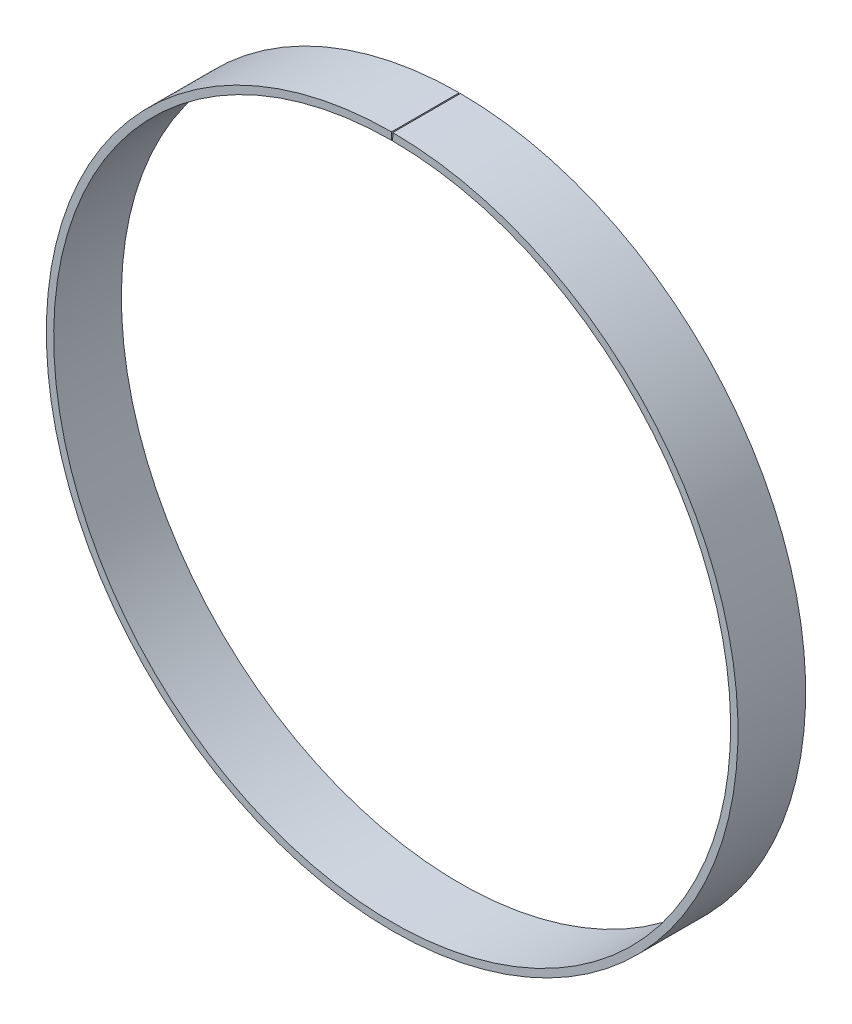
ISO-10303-21;
HEADER;
FILE_DESCRIPTION(('STEP AP214'),'2;1');
FILE_NAME('part.step','',(''),(''),'','','');
FILE_SCHEMA(('AUTOMOTIVE_DESIGN { 1 0 10303 214 1 1 1 1 }'));
ENDSEC;
DATA;
#1=APPLICATION_CONTEXT('core data for automotive mechanical design processes');
#2=APPLICATION_PROTOCOL_DEFINITION('international standard','automotive_design',2000,#1);
#3=PRODUCT_CONTEXT('',#1,'mechanical');
#4=PRODUCT('Part','Part','',(#3));
#5=PRODUCT_RELATED_PRODUCT_CATEGORY('part','',(#4));
#6=PRODUCT_DEFINITION_FORMATION('','',#4);
#7=PRODUCT_DEFINITION_CONTEXT('part definition',#1,'design');
#8=PRODUCT_DEFINITION('design','',#6,#7);
#9=PRODUCT_DEFINITION_SHAPE('','',#8);
#10=(LENGTH_UNIT() NAMED_UNIT(*) SI_UNIT(.MILLI.,.METRE.));
#11=(NAMED_UNIT(*) PLANE_ANGLE_UNIT() SI_UNIT($,.RADIAN.));
#12=(NAMED_UNIT(*) SI_UNIT($,.STERADIAN.) SOLID_ANGLE_UNIT());
#13=UNCERTAINTY_MEASURE_WITH_UNIT(LENGTH_MEASURE(1.E-05),#10,'distance_accuracy_value','');
#14=(GEOMETRIC_REPRESENTATION_CONTEXT(3) GLOBAL_UNCERTAINTY_ASSIGNED_CONTEXT((#13)) GLOBAL_UNIT_ASSIGNED_CONTEXT((#10,
#11,#12)) REPRESENTATION_CONTEXT('',''));
#15=CARTESIAN_POINT('',(0.,0.,0.));
#16=DIRECTION('',(0.,0.,1.));
#17=DIRECTION('',(1.,0.,0.));
#18=AXIS2_PLACEMENT_3D('',#15,#16,#17);
#19=CARTESIAN_POINT('',(0.,0.,23.));
#20=DIRECTION('',(0.,0.,-1.));
#21=DIRECTION('',(-1.,0.,0.));
#22=AXIS2_PLACEMENT_3D('',#19,#20,#21);
#23=CYLINDRICAL_SURFACE('',#22,117.5);
#24=CARTESIAN_POINT('',(0.,0.,0.));
#25=DIRECTION('',(0.,0.,1.));
#26=DIRECTION('',(1.,0.,0.));
#27=AXIS2_PLACEMENT_3D('',#24,#25,#26);
#28=CIRCLE('',#27,117.5);
#29=CARTESIAN_POINT('',(-0.205076082993084,117.499821037311,0.));
#30=VERTEX_POINT('',#29);
#31=CARTESIAN_POINT('',(0.205076082993046,117.499821037311,0.));
#32=VERTEX_POINT('',#31);
#33=EDGE_CURVE('E101',#30,#32,#28,.T.);
#34=ORIENTED_EDGE('',*,*,#33,.T.);
#35=DIRECTION('',(0.,0.,-1.));
#36=VECTOR('',#35,1.);
#37=CARTESIAN_POINT('',(0.205076082993046,117.499821037311,23.));
#38=LINE('',#37,#36);
#39=CARTESIAN_POINT('',(0.205076082993046,117.499821037311,23.));
#40=VERTEX_POINT('',#39);
#41=EDGE_CURVE('E11',#40,#32,#38,.T.);
#42=ORIENTED_EDGE('',*,*,#41,.F.);
#43=CARTESIAN_POINT('',(0.,0.,23.));
#44=DIRECTION('',(0.,0.,1.));
#45=DIRECTION('',(1.,0.,0.));
#46=AXIS2_PLACEMENT_3D('',#43,#44,#45);
#47=CIRCLE('',#46,117.5);
#48=CARTESIAN_POINT('',(-0.205076082993084,117.499821037311,23.));
#49=VERTEX_POINT('',#48);
#50=EDGE_CURVE('E78',#49,#40,#47,.T.);
#51=ORIENTED_EDGE('',*,*,#50,.F.);
#52=DIRECTION('',(0.,0.,-1.));
#53=VECTOR('',#52,1.);
#54=CARTESIAN_POINT('',(-0.205076082993084,117.499821037311,23.));
#55=LINE('',#54,#53);
#56=EDGE_CURVE('E54',#49,#30,#55,.T.);
#57=ORIENTED_EDGE('',*,*,#56,.T.);
#58=EDGE_LOOP('',(#34,#42,#51,#57));
#59=FACE_BOUND('',#58,.T.);
#60=ADVANCED_FACE('F38',(#59),#23,.T.);
#61=CARTESIAN_POINT('',(0.2007127620783,114.999824845028,23.));
#62=DIRECTION('',(-0.999998476913288,0.00174532836589825,0.));
#63=DIRECTION('',(-0.00174532836589825,-0.999998476913288,0.));
#64=AXIS2_PLACEMENT_3D('',#61,#62,#63);
#65=PLANE('',#64);
#66=DIRECTION('',(0.00174532836589825,0.999998476913288,0.));
#67=VECTOR('',#66,1.);
#68=CARTESIAN_POINT('',(0.2007127620783,114.999824845028,0.));
#69=LINE('',#68,#67);
#70=CARTESIAN_POINT('',(0.2007127620783,114.999824845028,0.));
#71=VERTEX_POINT('',#70);
#72=EDGE_CURVE('E87',#71,#32,#69,.T.);
#73=ORIENTED_EDGE('',*,*,#72,.F.);
#74=DIRECTION('',(0.,0.,-1.));
#75=VECTOR('',#74,1.);
#76=CARTESIAN_POINT('',(0.2007127620783,114.999824845028,23.));
#77=LINE('',#76,#75);
#78=CARTESIAN_POINT('',(0.2007127620783,114.999824845028,23.));
#79=VERTEX_POINT('',#78);
#80=EDGE_CURVE('E46',#79,#71,#77,.T.);
#81=ORIENTED_EDGE('',*,*,#80,.F.);
#82=DIRECTION('',(0.00174532836589825,0.999998476913288,0.));
#83=VECTOR('',#82,1.);
#84=CARTESIAN_POINT('',(0.2007127620783,114.999824845028,23.));
#85=LINE('',#84,#83);
#86=EDGE_CURVE('E85',#79,#40,#85,.T.);
#87=ORIENTED_EDGE('',*,*,#86,.T.);
#88=ORIENTED_EDGE('',*,*,#41,.T.);
#89=EDGE_LOOP('',(#73,#81,#87,#88));
#90=FACE_BOUND('',#89,.T.);
#91=ADVANCED_FACE('F84',(#90),#65,.T.);
#92=CARTESIAN_POINT('',(0.,0.,23.));
#93=DIRECTION('',(0.,0.,-1.));
#94=DIRECTION('',(-1.,0.,0.));
#95=AXIS2_PLACEMENT_3D('',#92,#93,#94);
#96=CYLINDRICAL_SURFACE('',#95,115.);
#97=CARTESIAN_POINT('',(0.,0.,0.));
#98=DIRECTION('',(0.,0.,1.));
#99=DIRECTION('',(1.,0.,0.));
#100=AXIS2_PLACEMENT_3D('',#97,#98,#99);
#101=CIRCLE('',#100,115.);
#102=CARTESIAN_POINT('',(-0.200712762078337,114.999824845028,0.));
#103=VERTEX_POINT('',#102);
#104=EDGE_CURVE('E104',#103,#71,#101,.T.);
#105=ORIENTED_EDGE('',*,*,#104,.F.);
#106=DIRECTION('',(0.,0.,-1.));
#107=VECTOR('',#106,1.);
#108=CARTESIAN_POINT('',(-0.200712762078337,114.999824845028,23.));
#109=LINE('',#108,#107);
#110=CARTESIAN_POINT('',(-0.200712762078337,114.999824845028,23.));
#111=VERTEX_POINT('',#110);
#112=EDGE_CURVE('E67',#111,#103,#109,.T.);
#113=ORIENTED_EDGE('',*,*,#112,.F.);
#114=CARTESIAN_POINT('',(0.,0.,23.));
#115=DIRECTION('',(0.,0.,1.));
#116=DIRECTION('',(1.,0.,0.));
#117=AXIS2_PLACEMENT_3D('',#114,#115,#116);
#118=CIRCLE('',#117,115.);
#119=EDGE_CURVE('E93',#111,#79,#118,.T.);
#120=ORIENTED_EDGE('',*,*,#119,.T.);
#121=ORIENTED_EDGE('',*,*,#80,.T.);
#122=EDGE_LOOP('',(#105,#113,#120,#121));
#123=FACE_BOUND('',#122,.T.);
#124=ADVANCED_FACE('F95',(#123),#96,.F.);
#125=CARTESIAN_POINT('',(-0.205076082993084,117.499821037311,23.));
#126=DIRECTION('',(0.999998476913288,0.00174532836589859,0.));
#127=DIRECTION('',(-0.00174532836589859,0.999998476913288,0.));
#128=AXIS2_PLACEMENT_3D('',#125,#126,#127);
#129=PLANE('',#128);
#130=DIRECTION('',(0.00174532836589859,-0.999998476913288,0.));
#131=VECTOR('',#130,1.);
#132=CARTESIAN_POINT('',(-0.205076082993084,117.499821037311,0.));
#133=LINE('',#132,#131);
#134=EDGE_CURVE('E106',#30,#103,#133,.T.);
#135=ORIENTED_EDGE('',*,*,#134,.F.);
#136=ORIENTED_EDGE('',*,*,#56,.F.);
#137=DIRECTION('',(0.00174532836589859,-0.999998476913288,0.));
#138=VECTOR('',#137,1.);
#139=CARTESIAN_POINT('',(-0.205076082993084,117.499821037311,23.));
#140=LINE('',#139,#138);
#141=EDGE_CURVE('E96',#49,#111,#140,.T.);
#142=ORIENTED_EDGE('',*,*,#141,.T.);
#143=ORIENTED_EDGE('',*,*,#112,.T.);
#144=EDGE_LOOP('',(#135,#136,#142,#143));
#145=FACE_BOUND('',#144,.T.);
#146=ADVANCED_FACE('F112',(#145),#129,.T.);
#147=CARTESIAN_POINT('',(0.,0.,23.));
#148=DIRECTION('',(0.,0.,1.));
#149=DIRECTION('',(1.,0.,0.));
#150=AXIS2_PLACEMENT_3D('',#147,#148,#149);
#151=PLANE('',#150);
#152=ORIENTED_EDGE('',*,*,#50,.T.);
#153=ORIENTED_EDGE('',*,*,#86,.F.);
#154=ORIENTED_EDGE('',*,*,#119,.F.);
#155=ORIENTED_EDGE('',*,*,#141,.F.);
#156=EDGE_LOOP('',(#152,#153,#154,#155));
#157=FACE_BOUND('',#156,.T.);
#158=ADVANCED_FACE('F92',(#157),#151,.T.);
#159=CARTESIAN_POINT('',(0.,0.,0.));
#160=DIRECTION('',(0.,0.,1.));
#161=DIRECTION('',(1.,0.,0.));
#162=AXIS2_PLACEMENT_3D('',#159,#160,#161);
#163=PLANE('',#162);
#164=ORIENTED_EDGE('',*,*,#33,.F.);
#165=ORIENTED_EDGE('',*,*,#134,.T.);
#166=ORIENTED_EDGE('',*,*,#104,.T.);
#167=ORIENTED_EDGE('',*,*,#72,.T.);
#168=EDGE_LOOP('',(#164,#165,#166,#167));
#169=FACE_BOUND('',#168,.T.);
#170=ADVANCED_FACE('F111',(#169),#163,.F.);
#171=CLOSED_SHELL('',(#60,#91,#124,#146,#158,#170));
#172=MANIFOLD_SOLID_BREP('B2',#171);
#173=ADVANCED_BREP_SHAPE_REPRESENTATION('',(#18,#172),#14);
#174=SHAPE_DEFINITION_REPRESENTATION(#9,#173);
ENDSEC;
END-ISO-10303-21;
